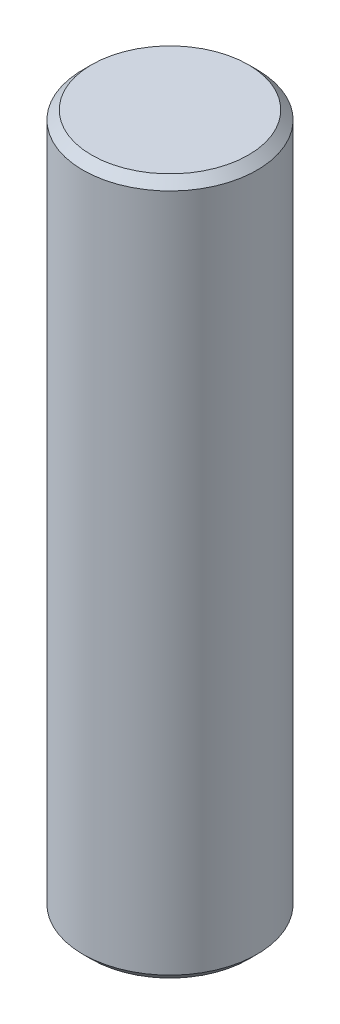
ISO-10303-21;
HEADER;
FILE_DESCRIPTION(('STEP AP214'),'2;1');
FILE_NAME('part.step','',(''),(''),'','','');
FILE_SCHEMA(('AUTOMOTIVE_DESIGN { 1 0 10303 214 1 1 1 1 }'));
ENDSEC;
DATA;
#1=APPLICATION_CONTEXT('core data for automotive mechanical design processes');
#2=APPLICATION_PROTOCOL_DEFINITION('international standard','automotive_design',2000,#1);
#3=PRODUCT_CONTEXT('',#1,'mechanical');
#4=PRODUCT('Part','Part','',(#3));
#5=PRODUCT_RELATED_PRODUCT_CATEGORY('part','',(#4));
#6=PRODUCT_DEFINITION_FORMATION('','',#4);
#7=PRODUCT_DEFINITION_CONTEXT('part definition',#1,'design');
#8=PRODUCT_DEFINITION('design','',#6,#7);
#9=PRODUCT_DEFINITION_SHAPE('','',#8);
#10=(LENGTH_UNIT() NAMED_UNIT(*) SI_UNIT(.MILLI.,.METRE.));
#11=(NAMED_UNIT(*) PLANE_ANGLE_UNIT() SI_UNIT($,.RADIAN.));
#12=(NAMED_UNIT(*) SI_UNIT($,.STERADIAN.) SOLID_ANGLE_UNIT());
#13=UNCERTAINTY_MEASURE_WITH_UNIT(LENGTH_MEASURE(1.E-05),#10,'distance_accuracy_value','');
#14=(GEOMETRIC_REPRESENTATION_CONTEXT(3) GLOBAL_UNCERTAINTY_ASSIGNED_CONTEXT((#13)) GLOBAL_UNIT_ASSIGNED_CONTEXT((#10,
#11,#12)) REPRESENTATION_CONTEXT('',''));
#15=CARTESIAN_POINT('',(0.,0.,0.));
#16=DIRECTION('',(0.,0.,1.));
#17=DIRECTION('',(1.,0.,0.));
#18=AXIS2_PLACEMENT_3D('',#15,#16,#17);
#19=CARTESIAN_POINT('',(0.,4.,0.));
#20=DIRECTION('',(0.,-1.,0.));
#21=DIRECTION('',(0.,0.,-1.));
#22=AXIS2_PLACEMENT_3D('',#19,#20,#21);
#23=CYLINDRICAL_SURFACE('',#22,1.);
#24=CARTESIAN_POINT('',(0.,-3.9,0.));
#25=DIRECTION('',(0.,1.,0.));
#26=DIRECTION('',(0.,0.,1.));
#27=AXIS2_PLACEMENT_3D('',#24,#25,#26);
#28=CIRCLE('',#27,1.);
#29=CARTESIAN_POINT('',(0.,-3.9,1.));
#30=VERTEX_POINT('',#29);
#31=EDGE_CURVE('E47',#30,#30,#28,.T.);
#32=ORIENTED_EDGE('',*,*,#31,.T.);
#33=EDGE_LOOP('',(#32));
#34=FACE_BOUND('',#33,.T.);
#35=CARTESIAN_POINT('',(0.,3.9,0.));
#36=DIRECTION('',(0.,1.,0.));
#37=DIRECTION('',(0.,0.,1.));
#38=AXIS2_PLACEMENT_3D('',#35,#36,#37);
#39=CIRCLE('',#38,1.);
#40=CARTESIAN_POINT('',(0.,3.9,1.));
#41=VERTEX_POINT('',#40);
#42=EDGE_CURVE('E51',#41,#41,#39,.F.);
#43=ORIENTED_EDGE('',*,*,#42,.T.);
#44=EDGE_LOOP('',(#43));
#45=FACE_BOUND('',#44,.T.);
#46=ADVANCED_FACE('F35',(#34,#45),#23,.T.);
#47=CARTESIAN_POINT('',(0.,4.,0.));
#48=DIRECTION('',(0.,1.,0.));
#49=DIRECTION('',(0.,0.,1.));
#50=AXIS2_PLACEMENT_3D('',#47,#48,#49);
#51=PLANE('',#50);
#52=CARTESIAN_POINT('',(0.,4.,0.));
#53=DIRECTION('',(0.,1.,0.));
#54=DIRECTION('',(0.,0.,1.));
#55=AXIS2_PLACEMENT_3D('',#52,#53,#54);
#56=CIRCLE('',#55,0.9);
#57=CARTESIAN_POINT('',(0.,4.,0.9));
#58=VERTEX_POINT('',#57);
#59=EDGE_CURVE('E10',#58,#58,#56,.T.);
#60=ORIENTED_EDGE('',*,*,#59,.T.);
#61=EDGE_LOOP('',(#60));
#62=FACE_BOUND('',#61,.T.);
#63=ADVANCED_FACE('F67',(#62),#51,.T.);
#64=CARTESIAN_POINT('',(0.,-4.,0.));
#65=DIRECTION('',(0.,1.,0.));
#66=DIRECTION('',(0.,0.,1.));
#67=AXIS2_PLACEMENT_3D('',#64,#65,#66);
#68=PLANE('',#67);
#69=CARTESIAN_POINT('',(0.,-4.,0.));
#70=DIRECTION('',(0.,1.,0.));
#71=DIRECTION('',(0.,0.,1.));
#72=AXIS2_PLACEMENT_3D('',#69,#70,#71);
#73=CIRCLE('',#72,0.900000000000001);
#74=CARTESIAN_POINT('',(0.,-4.,0.900000000000001));
#75=VERTEX_POINT('',#74);
#76=EDGE_CURVE('E43',#75,#75,#73,.F.);
#77=ORIENTED_EDGE('',*,*,#76,.T.);
#78=EDGE_LOOP('',(#77));
#79=FACE_BOUND('',#78,.T.);
#80=ADVANCED_FACE('F64',(#79),#68,.F.);
#81=CARTESIAN_POINT('',(0.,-3.9,0.));
#82=DIRECTION('',(0.,1.,0.));
#83=DIRECTION('',(0.,0.,1.));
#84=AXIS2_PLACEMENT_3D('',#81,#82,#83);
#85=CONICAL_SURFACE('',#84,1.,0.785398163397453);
#86=ORIENTED_EDGE('',*,*,#76,.F.);
#87=EDGE_LOOP('',(#86));
#88=FACE_BOUND('',#87,.T.);
#89=ORIENTED_EDGE('',*,*,#31,.F.);
#90=EDGE_LOOP('',(#89));
#91=FACE_BOUND('',#90,.T.);
#92=ADVANCED_FACE('F60',(#88,#91),#85,.T.);
#93=CARTESIAN_POINT('',(0.,4.,0.));
#94=DIRECTION('',(0.,-1.,0.));
#95=DIRECTION('',(0.,0.,-1.));
#96=AXIS2_PLACEMENT_3D('',#93,#94,#95);
#97=CONICAL_SURFACE('',#96,0.9,0.785398163397448);
#98=ORIENTED_EDGE('',*,*,#42,.F.);
#99=EDGE_LOOP('',(#98));
#100=FACE_BOUND('',#99,.T.);
#101=ORIENTED_EDGE('',*,*,#59,.F.);
#102=EDGE_LOOP('',(#101));
#103=FACE_BOUND('',#102,.T.);
#104=ADVANCED_FACE('F38',(#100,#103),#97,.T.);
#105=CLOSED_SHELL('',(#46,#63,#80,#92,#104));
#106=MANIFOLD_SOLID_BREP('B2',#105);
#107=ADVANCED_BREP_SHAPE_REPRESENTATION('',(#18,#106),#14);
#108=SHAPE_DEFINITION_REPRESENTATION(#9,#107);
ENDSEC;
END-ISO-10303-21;
